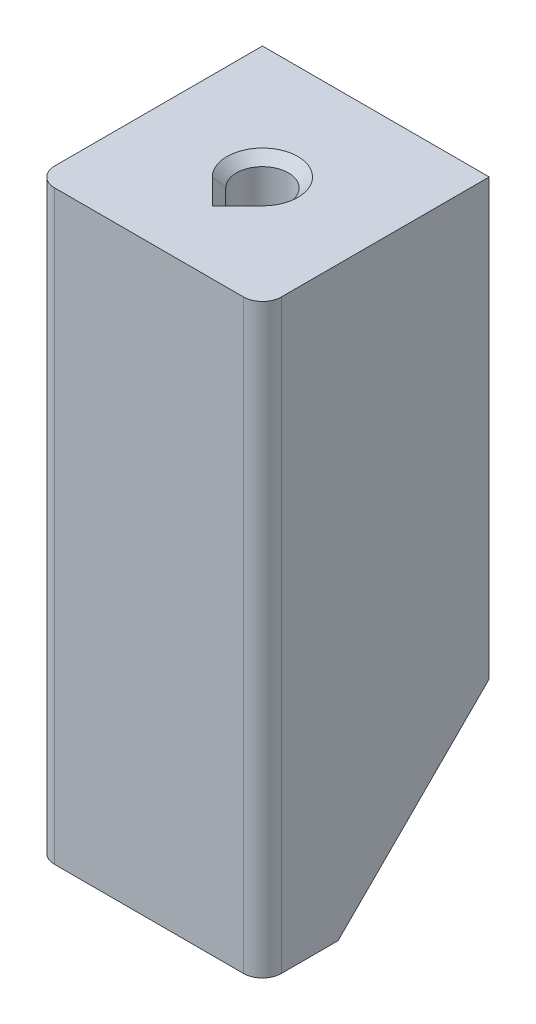
ISO-10303-21;
HEADER;
FILE_DESCRIPTION(('STEP AP214'),'2;1');
FILE_NAME('part.step','',(''),(''),'','','');
FILE_SCHEMA(('AUTOMOTIVE_DESIGN { 1 0 10303 214 1 1 1 1 }'));
ENDSEC;
DATA;
#1=APPLICATION_CONTEXT('core data for automotive mechanical design processes');
#2=APPLICATION_PROTOCOL_DEFINITION('international standard','automotive_design',2000,#1);
#3=PRODUCT_CONTEXT('',#1,'mechanical');
#4=PRODUCT('Part','Part','',(#3));
#5=PRODUCT_RELATED_PRODUCT_CATEGORY('part','',(#4));
#6=PRODUCT_DEFINITION_FORMATION('','',#4);
#7=PRODUCT_DEFINITION_CONTEXT('part definition',#1,'design');
#8=PRODUCT_DEFINITION('design','',#6,#7);
#9=PRODUCT_DEFINITION_SHAPE('','',#8);
#10=(LENGTH_UNIT() NAMED_UNIT(*) SI_UNIT(.MILLI.,.METRE.));
#11=(NAMED_UNIT(*) PLANE_ANGLE_UNIT() SI_UNIT($,.RADIAN.));
#12=(NAMED_UNIT(*) SI_UNIT($,.STERADIAN.) SOLID_ANGLE_UNIT());
#13=UNCERTAINTY_MEASURE_WITH_UNIT(LENGTH_MEASURE(1.E-05),#10,'distance_accuracy_value','');
#14=(GEOMETRIC_REPRESENTATION_CONTEXT(3) GLOBAL_UNCERTAINTY_ASSIGNED_CONTEXT((#13)) GLOBAL_UNIT_ASSIGNED_CONTEXT((#10,
#11,#12)) REPRESENTATION_CONTEXT('',''));
#15=CARTESIAN_POINT('',(0.,0.,0.));
#16=DIRECTION('',(0.,0.,1.));
#17=DIRECTION('',(1.,0.,0.));
#18=AXIS2_PLACEMENT_3D('',#15,#16,#17);
#19=CARTESIAN_POINT('',(-12.,15.9999999999998,-16.));
#20=DIRECTION('',(0.,0.,-1.));
#21=DIRECTION('',(-1.,0.,0.));
#22=AXIS2_PLACEMENT_3D('',#19,#20,#21);
#23=PLANE('',#22);
#24=DIRECTION('',(1.,0.,0.));
#25=VECTOR('',#24,1.);
#26=CARTESIAN_POINT('',(-12.,62.,-16.));
#27=LINE('',#26,#25);
#28=CARTESIAN_POINT('',(-12.,62.,-16.));
#29=VERTEX_POINT('',#28);
#30=CARTESIAN_POINT('',(12.,62.,-16.));
#31=VERTEX_POINT('',#30);
#32=EDGE_CURVE('E176',#29,#31,#27,.T.);
#33=ORIENTED_EDGE('',*,*,#32,.T.);
#34=DIRECTION('',(0.,1.,0.));
#35=VECTOR('',#34,1.);
#36=CARTESIAN_POINT('',(12.,15.9999999999998,-16.));
#37=LINE('',#36,#35);
#38=CARTESIAN_POINT('',(12.,15.9999999999998,-16.));
#39=VERTEX_POINT('',#38);
#40=EDGE_CURVE('E163',#39,#31,#37,.T.);
#41=ORIENTED_EDGE('',*,*,#40,.F.);
#42=DIRECTION('',(1.,0.,0.));
#43=VECTOR('',#42,1.);
#44=CARTESIAN_POINT('',(-12.,15.9999999999998,-16.));
#45=LINE('',#44,#43);
#46=CARTESIAN_POINT('',(-12.,15.9999999999998,-16.));
#47=VERTEX_POINT('',#46);
#48=EDGE_CURVE('E177',#47,#39,#45,.T.);
#49=ORIENTED_EDGE('',*,*,#48,.F.);
#50=DIRECTION('',(0.,1.,0.));
#51=VECTOR('',#50,1.);
#52=CARTESIAN_POINT('',(-12.,15.9999999999998,-16.));
#53=LINE('',#52,#51);
#54=EDGE_CURVE('E175',#47,#29,#53,.T.);
#55=ORIENTED_EDGE('',*,*,#54,.T.);
#56=EDGE_LOOP('',(#33,#41,#49,#55));
#57=FACE_BOUND('',#56,.T.);
#58=ADVANCED_FACE('F41',(#57),#23,.T.);
#59=CARTESIAN_POINT('',(-12.,0.,0.));
#60=DIRECTION('',(0.,-0.707106781186551,-0.707106781186544));
#61=DIRECTION('',(0.,0.707106781186544,-0.707106781186551));
#62=AXIS2_PLACEMENT_3D('',#59,#60,#61);
#63=PLANE('',#62);
#64=CARTESIAN_POINT('',(0.,4.00000000000001,-4.00000000000005));
#65=DIRECTION('',(0.,-0.707106781186551,-0.707106781186544));
#66=DIRECTION('',(0.,0.707106781186544,-0.707106781186551));
#67=AXIS2_PLACEMENT_3D('',#64,#65,#66);
#68=ELLIPSE('',#67,3.88908729652599,2.75);
#69=CARTESIAN_POINT('',(-1.94454364826302,2.05545635173704,-2.05545635173706));
#70=VERTEX_POINT('',#69);
#71=CARTESIAN_POINT('',(1.94454364826301,2.05545635173703,-2.05545635173705));
#72=VERTEX_POINT('',#71);
#73=EDGE_CURVE('E143',#70,#72,#68,.T.);
#74=ORIENTED_EDGE('',*,*,#73,.F.);
#75=DIRECTION('',(-0.577350269189624,0.577350269189624,-0.57735026918963));
#76=VECTOR('',#75,1.);
#77=CARTESIAN_POINT('',(-3.92605819768396,4.03697090115798,-4.03697090115802));
#78=LINE('',#77,#76);
#79=CARTESIAN_POINT('',(0.,0.110912703474022,-0.110912703474023));
#80=VERTEX_POINT('',#79);
#81=EDGE_CURVE('E132',#80,#70,#78,.T.);
#82=ORIENTED_EDGE('',*,*,#81,.F.);
#83=DIRECTION('',(-0.577350269189624,-0.577350269189624,0.57735026918963));
#84=VECTOR('',#83,1.);
#85=CARTESIAN_POINT('',(-4.07394180231599,-3.96302909884197,3.96302909884201));
#86=LINE('',#85,#84);
#87=EDGE_CURVE('E142',#72,#80,#86,.T.);
#88=ORIENTED_EDGE('',*,*,#87,.F.);
#89=EDGE_LOOP('',(#74,#82,#88));
#90=FACE_BOUND('',#89,.T.);
#91=ORIENTED_EDGE('',*,*,#48,.T.);
#92=DIRECTION('',(0.,0.707106781186544,-0.707106781186551));
#93=VECTOR('',#92,1.);
#94=CARTESIAN_POINT('',(12.,0.,0.));
#95=LINE('',#94,#93);
#96=CARTESIAN_POINT('',(12.,0.,0.));
#97=VERTEX_POINT('',#96);
#98=EDGE_CURVE('E156',#97,#39,#95,.T.);
#99=ORIENTED_EDGE('',*,*,#98,.F.);
#100=DIRECTION('',(1.,0.,0.));
#101=VECTOR('',#100,1.);
#102=CARTESIAN_POINT('',(-12.,0.,0.));
#103=LINE('',#102,#101);
#104=CARTESIAN_POINT('',(-12.,0.,0.));
#105=VERTEX_POINT('',#104);
#106=EDGE_CURVE('E181',#105,#97,#103,.T.);
#107=ORIENTED_EDGE('',*,*,#106,.F.);
#108=DIRECTION('',(0.,0.707106781186544,-0.707106781186551));
#109=VECTOR('',#108,1.);
#110=CARTESIAN_POINT('',(-12.,0.,0.));
#111=LINE('',#110,#109);
#112=EDGE_CURVE('E169',#105,#47,#111,.T.);
#113=ORIENTED_EDGE('',*,*,#112,.T.);
#114=EDGE_LOOP('',(#91,#99,#107,#113));
#115=FACE_BOUND('',#114,.T.);
#116=ADVANCED_FACE('F149',(#90,#115),#63,.T.);
#117=CARTESIAN_POINT('',(-12.,0.,8.));
#118=DIRECTION('',(0.,-1.,0.));
#119=DIRECTION('',(0.,0.,-1.));
#120=AXIS2_PLACEMENT_3D('',#117,#118,#119);
#121=PLANE('',#120);
#122=DIRECTION('',(1.,0.,0.));
#123=VECTOR('',#122,1.);
#124=CARTESIAN_POINT('',(-12.,0.,8.));
#125=LINE('',#124,#123);
#126=CARTESIAN_POINT('',(-10.,0.,8.));
#127=VERTEX_POINT('',#126);
#128=CARTESIAN_POINT('',(10.,0.,8.));
#129=VERTEX_POINT('',#128);
#130=EDGE_CURVE('E183',#127,#129,#125,.T.);
#131=ORIENTED_EDGE('',*,*,#130,.F.);
#132=CARTESIAN_POINT('',(-10.,0.,6.));
#133=DIRECTION('',(0.,-1.,0.));
#134=DIRECTION('',(0.,0.,-1.));
#135=AXIS2_PLACEMENT_3D('',#132,#133,#134);
#136=CIRCLE('',#135,2.);
#137=CARTESIAN_POINT('',(-12.,0.,6.));
#138=VERTEX_POINT('',#137);
#139=EDGE_CURVE('E193',#127,#138,#136,.T.);
#140=ORIENTED_EDGE('',*,*,#139,.T.);
#141=DIRECTION('',(0.,0.,-1.));
#142=VECTOR('',#141,1.);
#143=CARTESIAN_POINT('',(-12.,0.,8.));
#144=LINE('',#143,#142);
#145=EDGE_CURVE('E170',#138,#105,#144,.T.);
#146=ORIENTED_EDGE('',*,*,#145,.T.);
#147=ORIENTED_EDGE('',*,*,#106,.T.);
#148=DIRECTION('',(0.,0.,-1.));
#149=VECTOR('',#148,1.);
#150=CARTESIAN_POINT('',(12.,0.,8.));
#151=LINE('',#150,#149);
#152=CARTESIAN_POINT('',(12.,0.,6.));
#153=VERTEX_POINT('',#152);
#154=EDGE_CURVE('E154',#153,#97,#151,.T.);
#155=ORIENTED_EDGE('',*,*,#154,.F.);
#156=CARTESIAN_POINT('',(10.,0.,6.));
#157=DIRECTION('',(0.,-1.,0.));
#158=DIRECTION('',(0.,0.,-1.));
#159=AXIS2_PLACEMENT_3D('',#156,#157,#158);
#160=CIRCLE('',#159,2.);
#161=EDGE_CURVE('E194',#153,#129,#160,.T.);
#162=ORIENTED_EDGE('',*,*,#161,.T.);
#163=EDGE_LOOP('',(#131,#140,#146,#147,#155,#162));
#164=FACE_BOUND('',#163,.T.);
#165=ADVANCED_FACE('F252',(#164),#121,.T.);
#166=CARTESIAN_POINT('',(-12.,62.,8.));
#167=DIRECTION('',(0.,0.,1.));
#168=DIRECTION('',(1.,0.,0.));
#169=AXIS2_PLACEMENT_3D('',#166,#167,#168);
#170=PLANE('',#169);
#171=DIRECTION('',(1.,0.,0.));
#172=VECTOR('',#171,1.);
#173=CARTESIAN_POINT('',(-12.,62.,8.));
#174=LINE('',#173,#172);
#175=CARTESIAN_POINT('',(-10.,62.,8.));
#176=VERTEX_POINT('',#175);
#177=CARTESIAN_POINT('',(10.,62.,8.));
#178=VERTEX_POINT('',#177);
#179=EDGE_CURVE('E174',#176,#178,#174,.T.);
#180=ORIENTED_EDGE('',*,*,#179,.F.);
#181=DIRECTION('',(0.,-1.,0.));
#182=VECTOR('',#181,1.);
#183=CARTESIAN_POINT('',(-10.,0.,8.));
#184=LINE('',#183,#182);
#185=EDGE_CURVE('E188',#176,#127,#184,.T.);
#186=ORIENTED_EDGE('',*,*,#185,.T.);
#187=ORIENTED_EDGE('',*,*,#130,.T.);
#188=DIRECTION('',(0.,-1.,0.));
#189=VECTOR('',#188,1.);
#190=CARTESIAN_POINT('',(10.,62.,8.));
#191=LINE('',#190,#189);
#192=EDGE_CURVE('E178',#129,#178,#191,.F.);
#193=ORIENTED_EDGE('',*,*,#192,.T.);
#194=EDGE_LOOP('',(#180,#186,#187,#193));
#195=FACE_BOUND('',#194,.T.);
#196=ADVANCED_FACE('F232',(#195),#170,.T.);
#197=CARTESIAN_POINT('',(-12.,62.,0.));
#198=DIRECTION('',(0.,1.,0.));
#199=DIRECTION('',(0.,0.,1.));
#200=AXIS2_PLACEMENT_3D('',#197,#198,#199);
#201=PLANE('',#200);
#202=CARTESIAN_POINT('',(0.,62.,-4.));
#203=DIRECTION('',(0.,1.,0.));
#204=DIRECTION('',(0.,0.,1.));
#205=AXIS2_PLACEMENT_3D('',#202,#203,#204);
#206=CIRCLE('',#205,3.74999999999998);
#207=CARTESIAN_POINT('',(-2.65165042944955,62.,-1.34834957055048));
#208=VERTEX_POINT('',#207);
#209=CARTESIAN_POINT('',(2.65165042944955,62.,-1.34834957055048));
#210=VERTEX_POINT('',#209);
#211=EDGE_CURVE('E209',#208,#210,#206,.F.);
#212=ORIENTED_EDGE('',*,*,#211,.T.);
#213=DIRECTION('',(-0.707106781186544,0.,0.707106781186551));
#214=VECTOR('',#213,1.);
#215=CARTESIAN_POINT('',(0.707106781186538,62.,0.596194077712564));
#216=LINE('',#215,#214);
#217=CARTESIAN_POINT('',(0.,62.,1.30330085889911));
#218=VERTEX_POINT('',#217);
#219=EDGE_CURVE('E214',#210,#218,#216,.T.);
#220=ORIENTED_EDGE('',*,*,#219,.T.);
#221=DIRECTION('',(-0.707106781186544,0.,-0.707106781186551));
#222=VECTOR('',#221,1.);
#223=CARTESIAN_POINT('',(-2.65165042944955,62.,-1.34834957055047));
#224=LINE('',#223,#222);
#225=EDGE_CURVE('E212',#218,#208,#224,.T.);
#226=ORIENTED_EDGE('',*,*,#225,.T.);
#227=EDGE_LOOP('',(#212,#220,#226));
#228=FACE_BOUND('',#227,.T.);
#229=DIRECTION('',(0.,0.,1.));
#230=VECTOR('',#229,1.);
#231=CARTESIAN_POINT('',(-12.,62.,-16.));
#232=LINE('',#231,#230);
#233=CARTESIAN_POINT('',(-12.,62.,6.));
#234=VERTEX_POINT('',#233);
#235=EDGE_CURVE('E165',#29,#234,#232,.T.);
#236=ORIENTED_EDGE('',*,*,#235,.T.);
#237=CARTESIAN_POINT('',(-10.,62.,6.));
#238=DIRECTION('',(0.,1.,0.));
#239=DIRECTION('',(0.,0.,1.));
#240=AXIS2_PLACEMENT_3D('',#237,#238,#239);
#241=CIRCLE('',#240,2.);
#242=EDGE_CURVE('E203',#234,#176,#241,.T.);
#243=ORIENTED_EDGE('',*,*,#242,.T.);
#244=ORIENTED_EDGE('',*,*,#179,.T.);
#245=CARTESIAN_POINT('',(10.,62.,6.));
#246=DIRECTION('',(0.,1.,0.));
#247=DIRECTION('',(0.,0.,1.));
#248=AXIS2_PLACEMENT_3D('',#245,#246,#247);
#249=CIRCLE('',#248,2.);
#250=CARTESIAN_POINT('',(12.,62.,6.));
#251=VERTEX_POINT('',#250);
#252=EDGE_CURVE('E196',#178,#251,#249,.T.);
#253=ORIENTED_EDGE('',*,*,#252,.T.);
#254=DIRECTION('',(0.,0.,1.));
#255=VECTOR('',#254,1.);
#256=CARTESIAN_POINT('',(12.,62.,-16.));
#257=LINE('',#256,#255);
#258=EDGE_CURVE('E148',#31,#251,#257,.T.);
#259=ORIENTED_EDGE('',*,*,#258,.F.);
#260=ORIENTED_EDGE('',*,*,#32,.F.);
#261=EDGE_LOOP('',(#236,#243,#244,#253,#259,#260));
#262=FACE_BOUND('',#261,.T.);
#263=ADVANCED_FACE('F233',(#228,#262),#201,.T.);
#264=CARTESIAN_POINT('',(-12.,0.,0.));
#265=DIRECTION('',(1.,0.,0.));
#266=DIRECTION('',(0.,0.,-1.));
#267=AXIS2_PLACEMENT_3D('',#264,#265,#266);
#268=PLANE('',#267);
#269=ORIENTED_EDGE('',*,*,#145,.F.);
#270=DIRECTION('',(0.,-1.,0.));
#271=VECTOR('',#270,1.);
#272=CARTESIAN_POINT('',(-12.,62.,6.));
#273=LINE('',#272,#271);
#274=EDGE_CURVE('E200',#138,#234,#273,.F.);
#275=ORIENTED_EDGE('',*,*,#274,.T.);
#276=ORIENTED_EDGE('',*,*,#235,.F.);
#277=ORIENTED_EDGE('',*,*,#54,.F.);
#278=ORIENTED_EDGE('',*,*,#112,.F.);
#279=EDGE_LOOP('',(#269,#275,#276,#277,#278));
#280=FACE_BOUND('',#279,.T.);
#281=ADVANCED_FACE('F234',(#280),#268,.F.);
#282=CARTESIAN_POINT('',(12.,0.,0.));
#283=DIRECTION('',(1.,0.,0.));
#284=DIRECTION('',(0.,0.,-1.));
#285=AXIS2_PLACEMENT_3D('',#282,#283,#284);
#286=PLANE('',#285);
#287=ORIENTED_EDGE('',*,*,#258,.T.);
#288=DIRECTION('',(0.,-1.,0.));
#289=VECTOR('',#288,1.);
#290=CARTESIAN_POINT('',(12.,0.,6.));
#291=LINE('',#290,#289);
#292=EDGE_CURVE('E201',#251,#153,#291,.T.);
#293=ORIENTED_EDGE('',*,*,#292,.T.);
#294=ORIENTED_EDGE('',*,*,#154,.T.);
#295=ORIENTED_EDGE('',*,*,#98,.T.);
#296=ORIENTED_EDGE('',*,*,#40,.T.);
#297=EDGE_LOOP('',(#287,#293,#294,#295,#296));
#298=FACE_BOUND('',#297,.T.);
#299=ADVANCED_FACE('F256',(#298),#286,.T.);
#300=CARTESIAN_POINT('',(-10.,62.,6.));
#301=DIRECTION('',(0.,1.,0.));
#302=DIRECTION('',(0.,0.,1.));
#303=AXIS2_PLACEMENT_3D('',#300,#301,#302);
#304=CYLINDRICAL_SURFACE('',#303,2.);
#305=ORIENTED_EDGE('',*,*,#242,.F.);
#306=ORIENTED_EDGE('',*,*,#274,.F.);
#307=ORIENTED_EDGE('',*,*,#139,.F.);
#308=ORIENTED_EDGE('',*,*,#185,.F.);
#309=EDGE_LOOP('',(#305,#306,#307,#308));
#310=FACE_BOUND('',#309,.T.);
#311=ADVANCED_FACE('F246',(#310),#304,.T.);
#312=CARTESIAN_POINT('',(10.,0.,6.));
#313=DIRECTION('',(0.,-1.,0.));
#314=DIRECTION('',(0.,0.,-1.));
#315=AXIS2_PLACEMENT_3D('',#312,#313,#314);
#316=CYLINDRICAL_SURFACE('',#315,2.);
#317=ORIENTED_EDGE('',*,*,#252,.F.);
#318=ORIENTED_EDGE('',*,*,#192,.F.);
#319=ORIENTED_EDGE('',*,*,#161,.F.);
#320=ORIENTED_EDGE('',*,*,#292,.F.);
#321=EDGE_LOOP('',(#317,#318,#319,#320));
#322=FACE_BOUND('',#321,.T.);
#323=ADVANCED_FACE('F260',(#322),#316,.T.);
#324=CARTESIAN_POINT('',(0.,0.,-4.00000000000005));
#325=DIRECTION('',(0.,1.,0.));
#326=DIRECTION('',(0.,0.,1.));
#327=AXIS2_PLACEMENT_3D('',#324,#325,#326);
#328=CYLINDRICAL_SURFACE('',#327,2.75);
#329=DIRECTION('',(0.,1.,0.));
#330=VECTOR('',#329,1.);
#331=CARTESIAN_POINT('',(1.94454364826302,0.,-2.05545635173706));
#332=LINE('',#331,#330);
#333=CARTESIAN_POINT('',(1.94454364826302,61.,-2.055456351737));
#334=VERTEX_POINT('',#333);
#335=EDGE_CURVE('E145',#72,#334,#332,.T.);
#336=ORIENTED_EDGE('',*,*,#335,.T.);
#337=CARTESIAN_POINT('',(0.,61.,-4.));
#338=DIRECTION('',(0.,1.,0.));
#339=DIRECTION('',(0.,0.,1.));
#340=AXIS2_PLACEMENT_3D('',#337,#338,#339);
#341=CIRCLE('',#340,2.75);
#342=CARTESIAN_POINT('',(-1.94454364826302,61.,-2.055456351737));
#343=VERTEX_POINT('',#342);
#344=EDGE_CURVE('E11',#334,#343,#341,.T.);
#345=ORIENTED_EDGE('',*,*,#344,.T.);
#346=DIRECTION('',(0.,1.,0.));
#347=VECTOR('',#346,1.);
#348=CARTESIAN_POINT('',(-1.94454364826302,0.,-2.05545635173706));
#349=LINE('',#348,#347);
#350=EDGE_CURVE('E134',#70,#343,#349,.T.);
#351=ORIENTED_EDGE('',*,*,#350,.F.);
#352=ORIENTED_EDGE('',*,*,#73,.T.);
#353=EDGE_LOOP('',(#336,#345,#351,#352));
#354=FACE_BOUND('',#353,.T.);
#355=ADVANCED_FACE('F144',(#354),#328,.F.);
#356=CARTESIAN_POINT('',(-0.0554563517370073,0.,-0.0554563517370119));
#357=DIRECTION('',(0.707106781186551,0.,0.707106781186544));
#358=DIRECTION('',(0.707106781186544,0.,-0.707106781186551));
#359=AXIS2_PLACEMENT_3D('',#356,#357,#358);
#360=PLANE('',#359);
#361=DIRECTION('',(0.,1.,0.));
#362=VECTOR('',#361,1.);
#363=CARTESIAN_POINT('',(0.,0.,-0.11091270347402));
#364=LINE('',#363,#362);
#365=CARTESIAN_POINT('',(0.,61.,-0.110912703473967));
#366=VERTEX_POINT('',#365);
#367=EDGE_CURVE('E138',#80,#366,#364,.T.);
#368=ORIENTED_EDGE('',*,*,#367,.T.);
#369=DIRECTION('',(0.707106781186544,0.,-0.707106781186551));
#370=VECTOR('',#369,1.);
#371=CARTESIAN_POINT('',(1.94454364826302,61.,-2.055456351737));
#372=LINE('',#371,#370);
#373=EDGE_CURVE('E207',#366,#334,#372,.T.);
#374=ORIENTED_EDGE('',*,*,#373,.T.);
#375=ORIENTED_EDGE('',*,*,#335,.F.);
#376=ORIENTED_EDGE('',*,*,#87,.T.);
#377=EDGE_LOOP('',(#368,#374,#375,#376));
#378=FACE_BOUND('',#377,.T.);
#379=ADVANCED_FACE('F228',(#378),#360,.F.);
#380=CARTESIAN_POINT('',(0.0554563517370076,0.,-0.0554563517370121));
#381=DIRECTION('',(-0.707106781186551,0.,0.707106781186544));
#382=DIRECTION('',(0.707106781186544,0.,0.707106781186551));
#383=AXIS2_PLACEMENT_3D('',#380,#381,#382);
#384=PLANE('',#383);
#385=ORIENTED_EDGE('',*,*,#350,.T.);
#386=DIRECTION('',(0.707106781186544,0.,0.707106781186551));
#387=VECTOR('',#386,1.);
#388=CARTESIAN_POINT('',(0.,61.,-0.110912703473967));
#389=LINE('',#388,#387);
#390=EDGE_CURVE('E51',#343,#366,#389,.T.);
#391=ORIENTED_EDGE('',*,*,#390,.T.);
#392=ORIENTED_EDGE('',*,*,#367,.F.);
#393=ORIENTED_EDGE('',*,*,#81,.T.);
#394=EDGE_LOOP('',(#385,#391,#392,#393));
#395=FACE_BOUND('',#394,.T.);
#396=ADVANCED_FACE('F135',(#395),#384,.F.);
#397=CARTESIAN_POINT('',(0.0554563517370076,61.,-0.0554563517369592));
#398=DIRECTION('',(0.500000000000005,0.707106781186545,-0.499999999999999));
#399=DIRECTION('',(-0.707106781186544,0.,-0.707106781186551));
#400=AXIS2_PLACEMENT_3D('',#397,#398,#399);
#401=PLANE('',#400);
#402=DIRECTION('',(0.,-0.577350269189626,-0.816496580927726));
#403=VECTOR('',#402,1.);
#404=CARTESIAN_POINT('',(0.,61.0261423749154,-0.0739418023159618));
#405=LINE('',#404,#403);
#406=EDGE_CURVE('E63',#366,#218,#405,.F.);
#407=ORIENTED_EDGE('',*,*,#406,.F.);
#408=ORIENTED_EDGE('',*,*,#390,.F.);
#409=DIRECTION('',(0.5,-0.70710678118655,-0.499999999999996));
#410=VECTOR('',#409,1.);
#411=CARTESIAN_POINT('',(-2.65165042944955,62.,-1.34834957055047));
#412=LINE('',#411,#410);
#413=EDGE_CURVE('E46',#208,#343,#412,.T.);
#414=ORIENTED_EDGE('',*,*,#413,.F.);
#415=ORIENTED_EDGE('',*,*,#225,.F.);
#416=EDGE_LOOP('',(#407,#408,#414,#415));
#417=FACE_BOUND('',#416,.T.);
#418=ADVANCED_FACE('F42',(#417),#401,.T.);
#419=CARTESIAN_POINT('',(0.,61.,-4.));
#420=DIRECTION('',(0.,1.,0.));
#421=DIRECTION('',(0.,0.,1.));
#422=AXIS2_PLACEMENT_3D('',#419,#420,#421);
#423=CONICAL_SURFACE('',#422,2.75,0.785398163397445);
#424=ORIENTED_EDGE('',*,*,#413,.T.);
#425=ORIENTED_EDGE('',*,*,#344,.F.);
#426=DIRECTION('',(-0.500000000000001,-0.707106781186549,-0.499999999999997));
#427=VECTOR('',#426,1.);
#428=CARTESIAN_POINT('',(2.65165042944955,62.,-1.34834957055048));
#429=LINE('',#428,#427);
#430=EDGE_CURVE('E220',#210,#334,#429,.T.);
#431=ORIENTED_EDGE('',*,*,#430,.F.);
#432=ORIENTED_EDGE('',*,*,#211,.F.);
#433=EDGE_LOOP('',(#424,#425,#431,#432));
#434=FACE_BOUND('',#433,.T.);
#435=ADVANCED_FACE('F225',(#434),#423,.F.);
#436=CARTESIAN_POINT('',(-0.0554563517370073,61.,-0.055456351736959));
#437=DIRECTION('',(-0.500000000000004,0.707106781186546,-0.499999999999999));
#438=DIRECTION('',(-0.707106781186544,0.,0.707106781186551));
#439=AXIS2_PLACEMENT_3D('',#436,#437,#438);
#440=PLANE('',#439);
#441=ORIENTED_EDGE('',*,*,#406,.T.);
#442=ORIENTED_EDGE('',*,*,#219,.F.);
#443=ORIENTED_EDGE('',*,*,#430,.T.);
#444=ORIENTED_EDGE('',*,*,#373,.F.);
#445=EDGE_LOOP('',(#441,#442,#443,#444));
#446=FACE_BOUND('',#445,.T.);
#447=ADVANCED_FACE('F230',(#446),#440,.T.);
#448=CLOSED_SHELL('',(#58,#116,#165,#196,#263,#281,#299,#311,#323,#355,#379,#396,#418,#435,#447));
#449=MANIFOLD_SOLID_BREP('B2',#448);
#450=ADVANCED_BREP_SHAPE_REPRESENTATION('',(#18,#449),#14);
#451=SHAPE_DEFINITION_REPRESENTATION(#9,#450);
ENDSEC;
END-ISO-10303-21;
